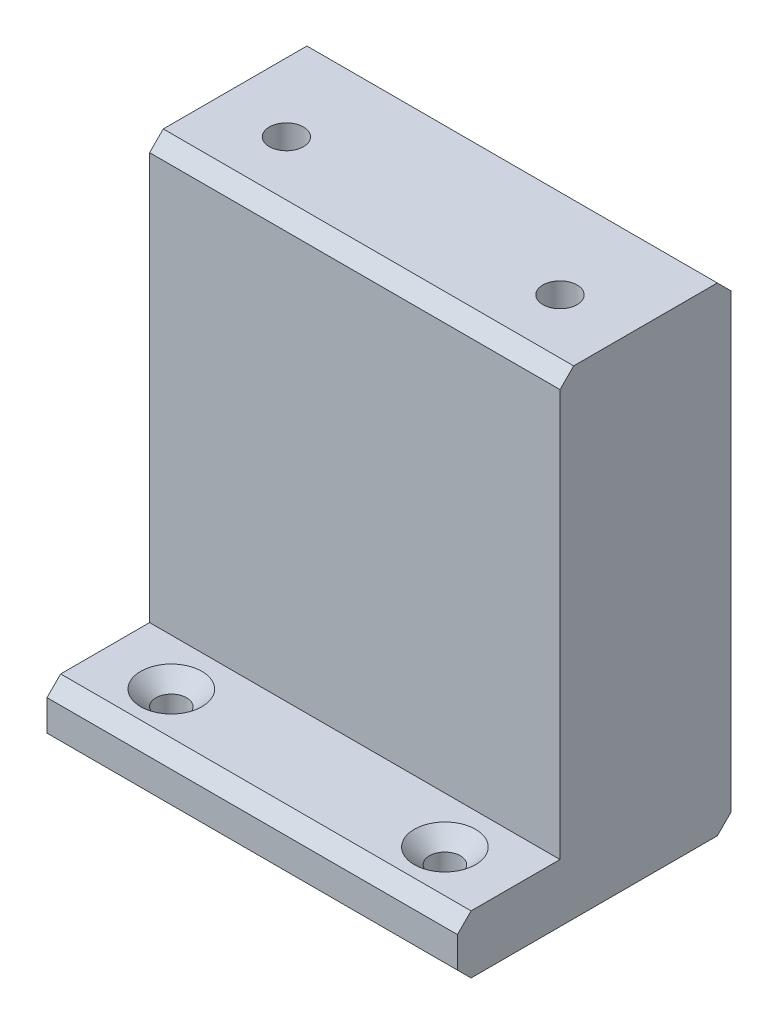
ISO-10303-21;
HEADER;
FILE_DESCRIPTION(('STEP AP214'),'2;1');
FILE_NAME('part.step','',(''),(''),'','','');
FILE_SCHEMA(('AUTOMOTIVE_DESIGN { 1 0 10303 214 1 1 1 1 }'));
ENDSEC;
DATA;
#1=APPLICATION_CONTEXT('core data for automotive mechanical design processes');
#2=APPLICATION_PROTOCOL_DEFINITION('international standard','automotive_design',2000,#1);
#3=PRODUCT_CONTEXT('',#1,'mechanical');
#4=PRODUCT('Part','Part','',(#3));
#5=PRODUCT_RELATED_PRODUCT_CATEGORY('part','',(#4));
#6=PRODUCT_DEFINITION_FORMATION('','',#4);
#7=PRODUCT_DEFINITION_CONTEXT('part definition',#1,'design');
#8=PRODUCT_DEFINITION('design','',#6,#7);
#9=PRODUCT_DEFINITION_SHAPE('','',#8);
#10=(LENGTH_UNIT() NAMED_UNIT(*) SI_UNIT(.MILLI.,.METRE.));
#11=(NAMED_UNIT(*) PLANE_ANGLE_UNIT() SI_UNIT($,.RADIAN.));
#12=(NAMED_UNIT(*) SI_UNIT($,.STERADIAN.) SOLID_ANGLE_UNIT());
#13=UNCERTAINTY_MEASURE_WITH_UNIT(LENGTH_MEASURE(1.E-05),#10,'distance_accuracy_value','');
#14=(GEOMETRIC_REPRESENTATION_CONTEXT(3) GLOBAL_UNCERTAINTY_ASSIGNED_CONTEXT((#13)) GLOBAL_UNIT_ASSIGNED_CONTEXT((#10,
#11,#12)) REPRESENTATION_CONTEXT('',''));
#15=CARTESIAN_POINT('',(0.,0.,0.));
#16=DIRECTION('',(0.,0.,1.));
#17=DIRECTION('',(1.,0.,0.));
#18=AXIS2_PLACEMENT_3D('',#15,#16,#17);
#19=CARTESIAN_POINT('',(0.,0.,0.));
#20=DIRECTION('',(0.,-1.,0.));
#21=DIRECTION('',(0.,0.,-1.));
#22=AXIS2_PLACEMENT_3D('',#19,#20,#21);
#23=PLANE('',#22);
#24=DIRECTION('',(0.,0.,1.));
#25=VECTOR('',#24,1.);
#26=CARTESIAN_POINT('',(-30.,0.,20.));
#27=LINE('',#26,#25);
#28=CARTESIAN_POINT('',(-30.,0.,-18.));
#29=VERTEX_POINT('',#28);
#30=CARTESIAN_POINT('',(-30.,0.,18.));
#31=VERTEX_POINT('',#30);
#32=EDGE_CURVE('E292',#29,#31,#27,.T.);
#33=ORIENTED_EDGE('',*,*,#32,.F.);
#34=DIRECTION('',(1.,0.,0.));
#35=VECTOR('',#34,1.);
#36=CARTESIAN_POINT('',(30.,0.,-18.));
#37=LINE('',#36,#35);
#38=CARTESIAN_POINT('',(30.,0.,-18.));
#39=VERTEX_POINT('',#38);
#40=EDGE_CURVE('E342',#29,#39,#37,.T.);
#41=ORIENTED_EDGE('',*,*,#40,.T.);
#42=DIRECTION('',(0.,0.,-1.));
#43=VECTOR('',#42,1.);
#44=CARTESIAN_POINT('',(30.,0.,20.));
#45=LINE('',#44,#43);
#46=CARTESIAN_POINT('',(30.,0.,18.));
#47=VERTEX_POINT('',#46);
#48=EDGE_CURVE('E286',#47,#39,#45,.T.);
#49=ORIENTED_EDGE('',*,*,#48,.F.);
#50=DIRECTION('',(-1.,0.,0.));
#51=VECTOR('',#50,1.);
#52=CARTESIAN_POINT('',(-30.,0.,18.));
#53=LINE('',#52,#51);
#54=EDGE_CURVE('E339',#47,#31,#53,.T.);
#55=ORIENTED_EDGE('',*,*,#54,.T.);
#56=EDGE_LOOP('',(#33,#41,#49,#55));
#57=FACE_BOUND('',#56,.T.);
#58=CARTESIAN_POINT('',(20.,0.,11.825));
#59=DIRECTION('',(0.,1.,0.));
#60=DIRECTION('',(0.,0.,1.));
#61=AXIS2_PLACEMENT_3D('',#58,#59,#60);
#62=CIRCLE('',#61,2.25);
#63=CARTESIAN_POINT('',(20.,0.,14.075));
#64=VERTEX_POINT('',#63);
#65=EDGE_CURVE('E264',#64,#64,#62,.T.);
#66=ORIENTED_EDGE('',*,*,#65,.T.);
#67=EDGE_LOOP('',(#66));
#68=FACE_BOUND('',#67,.T.);
#69=CARTESIAN_POINT('',(-20.,0.,11.825));
#70=DIRECTION('',(0.,1.,0.));
#71=DIRECTION('',(0.,0.,1.));
#72=AXIS2_PLACEMENT_3D('',#69,#70,#71);
#73=CIRCLE('',#72,2.25);
#74=CARTESIAN_POINT('',(-20.,0.,14.075));
#75=VERTEX_POINT('',#74);
#76=EDGE_CURVE('E252',#75,#75,#73,.T.);
#77=ORIENTED_EDGE('',*,*,#76,.T.);
#78=EDGE_LOOP('',(#77));
#79=FACE_BOUND('',#78,.T.);
#80=ADVANCED_FACE('F43',(#57,#68,#79),#23,.T.);
#81=CARTESIAN_POINT('',(30.,70.,20.));
#82=DIRECTION('',(-1.,0.,0.));
#83=DIRECTION('',(0.,0.,1.));
#84=AXIS2_PLACEMENT_3D('',#81,#82,#83);
#85=PLANE('',#84);
#86=ORIENTED_EDGE('',*,*,#48,.T.);
#87=DIRECTION('',(0.,0.707106781186545,-0.70710678118655));
#88=VECTOR('',#87,1.);
#89=CARTESIAN_POINT('',(30.,2.00000000000002,-20.));
#90=LINE('',#89,#88);
#91=CARTESIAN_POINT('',(30.,2.00000000000002,-20.));
#92=VERTEX_POINT('',#91);
#93=EDGE_CURVE('E355',#39,#92,#90,.T.);
#94=ORIENTED_EDGE('',*,*,#93,.T.);
#95=DIRECTION('',(0.,-1.,0.));
#96=VECTOR('',#95,1.);
#97=CARTESIAN_POINT('',(30.,70.,-20.));
#98=LINE('',#97,#96);
#99=CARTESIAN_POINT('',(30.,68.,-20.));
#100=VERTEX_POINT('',#99);
#101=EDGE_CURVE('E313',#100,#92,#98,.T.);
#102=ORIENTED_EDGE('',*,*,#101,.F.);
#103=DIRECTION('',(0.,-0.70710678118655,-0.707106781186545));
#104=VECTOR('',#103,1.);
#105=CARTESIAN_POINT('',(30.,70.,-18.));
#106=LINE('',#105,#104);
#107=CARTESIAN_POINT('',(30.,70.,-18.));
#108=VERTEX_POINT('',#107);
#109=EDGE_CURVE('E348',#100,#108,#106,.F.);
#110=ORIENTED_EDGE('',*,*,#109,.T.);
#111=DIRECTION('',(0.,0.,-1.));
#112=VECTOR('',#111,1.);
#113=CARTESIAN_POINT('',(30.,70.,20.));
#114=LINE('',#113,#112);
#115=CARTESIAN_POINT('',(30.,70.,2.99999999999999));
#116=VERTEX_POINT('',#115);
#117=EDGE_CURVE('E287',#116,#108,#114,.T.);
#118=ORIENTED_EDGE('',*,*,#117,.F.);
#119=DIRECTION('',(0.,0.70710678118655,-0.707106781186545));
#120=VECTOR('',#119,1.);
#121=CARTESIAN_POINT('',(30.,70.,2.99999999999999));
#122=LINE('',#121,#120);
#123=CARTESIAN_POINT('',(30.,68.,5.));
#124=VERTEX_POINT('',#123);
#125=EDGE_CURVE('E345',#116,#124,#122,.F.);
#126=ORIENTED_EDGE('',*,*,#125,.T.);
#127=DIRECTION('',(0.,1.,0.));
#128=VECTOR('',#127,1.);
#129=CARTESIAN_POINT('',(30.,8.5,5.));
#130=LINE('',#129,#128);
#131=CARTESIAN_POINT('',(30.,8.5,5.));
#132=VERTEX_POINT('',#131);
#133=EDGE_CURVE('E268',#132,#124,#130,.T.);
#134=ORIENTED_EDGE('',*,*,#133,.F.);
#135=DIRECTION('',(0.,0.,-1.));
#136=VECTOR('',#135,1.);
#137=CARTESIAN_POINT('',(30.,8.5,20.));
#138=LINE('',#137,#136);
#139=CARTESIAN_POINT('',(30.,8.5,18.));
#140=VERTEX_POINT('',#139);
#141=EDGE_CURVE('E272',#140,#132,#138,.T.);
#142=ORIENTED_EDGE('',*,*,#141,.F.);
#143=DIRECTION('',(0.,0.707106781186546,-0.707106781186549));
#144=VECTOR('',#143,1.);
#145=CARTESIAN_POINT('',(30.,8.5,18.));
#146=LINE('',#145,#144);
#147=CARTESIAN_POINT('',(30.,6.50000000000002,20.));
#148=VERTEX_POINT('',#147);
#149=EDGE_CURVE('E68',#140,#148,#146,.F.);
#150=ORIENTED_EDGE('',*,*,#149,.T.);
#151=DIRECTION('',(0.,-1.,0.));
#152=VECTOR('',#151,1.);
#153=CARTESIAN_POINT('',(30.,70.,20.));
#154=LINE('',#153,#152);
#155=CARTESIAN_POINT('',(30.,2.00000000000002,20.));
#156=VERTEX_POINT('',#155);
#157=EDGE_CURVE('E296',#148,#156,#154,.T.);
#158=ORIENTED_EDGE('',*,*,#157,.T.);
#159=DIRECTION('',(0.,-0.707106781186545,-0.70710678118655));
#160=VECTOR('',#159,1.);
#161=CARTESIAN_POINT('',(30.,2.00000000000002,20.));
#162=LINE('',#161,#160);
#163=EDGE_CURVE('E60',#156,#47,#162,.T.);
#164=ORIENTED_EDGE('',*,*,#163,.T.);
#165=EDGE_LOOP('',(#86,#94,#102,#110,#118,#126,#134,#142,#150,#158,#164));
#166=FACE_BOUND('',#165,.T.);
#167=ADVANCED_FACE('F388',(#166),#85,.F.);
#168=CARTESIAN_POINT('',(-30.,70.,-20.));
#169=DIRECTION('',(0.,0.,1.));
#170=DIRECTION('',(1.,0.,0.));
#171=AXIS2_PLACEMENT_3D('',#168,#169,#170);
#172=PLANE('',#171);
#173=CARTESIAN_POINT('',(-20.,55.,-20.));
#174=DIRECTION('',(0.,0.,-1.));
#175=DIRECTION('',(-1.,0.,0.));
#176=AXIS2_PLACEMENT_3D('',#173,#174,#175);
#177=CIRCLE('',#176,2.5);
#178=CARTESIAN_POINT('',(-22.5,55.,-20.));
#179=VERTEX_POINT('',#178);
#180=EDGE_CURVE('E180',#179,#179,#177,.T.);
#181=ORIENTED_EDGE('',*,*,#180,.F.);
#182=EDGE_LOOP('',(#181));
#183=FACE_BOUND('',#182,.T.);
#184=CARTESIAN_POINT('',(20.,15.,-20.));
#185=DIRECTION('',(0.,0.,-1.));
#186=DIRECTION('',(-1.,0.,0.));
#187=AXIS2_PLACEMENT_3D('',#184,#185,#186);
#188=CIRCLE('',#187,2.5);
#189=CARTESIAN_POINT('',(17.5,15.,-20.));
#190=VERTEX_POINT('',#189);
#191=EDGE_CURVE('E196',#190,#190,#188,.T.);
#192=ORIENTED_EDGE('',*,*,#191,.F.);
#193=EDGE_LOOP('',(#192));
#194=FACE_BOUND('',#193,.T.);
#195=CARTESIAN_POINT('',(20.,55.,-20.));
#196=DIRECTION('',(0.,0.,-1.));
#197=DIRECTION('',(-1.,0.,0.));
#198=AXIS2_PLACEMENT_3D('',#195,#196,#197);
#199=CIRCLE('',#198,2.5);
#200=CARTESIAN_POINT('',(17.5,55.,-20.));
#201=VERTEX_POINT('',#200);
#202=EDGE_CURVE('E212',#201,#201,#199,.T.);
#203=ORIENTED_EDGE('',*,*,#202,.F.);
#204=EDGE_LOOP('',(#203));
#205=FACE_BOUND('',#204,.T.);
#206=CARTESIAN_POINT('',(-20.,15.,-20.));
#207=DIRECTION('',(0.,0.,-1.));
#208=DIRECTION('',(-1.,0.,0.));
#209=AXIS2_PLACEMENT_3D('',#206,#207,#208);
#210=CIRCLE('',#209,2.5);
#211=CARTESIAN_POINT('',(-22.5,15.,-20.));
#212=VERTEX_POINT('',#211);
#213=EDGE_CURVE('E228',#212,#212,#210,.T.);
#214=ORIENTED_EDGE('',*,*,#213,.F.);
#215=EDGE_LOOP('',(#214));
#216=FACE_BOUND('',#215,.T.);
#217=ORIENTED_EDGE('',*,*,#101,.T.);
#218=DIRECTION('',(-1.,0.,0.));
#219=VECTOR('',#218,1.);
#220=CARTESIAN_POINT('',(-30.,2.00000000000002,-20.));
#221=LINE('',#220,#219);
#222=CARTESIAN_POINT('',(-30.,2.00000000000002,-20.));
#223=VERTEX_POINT('',#222);
#224=EDGE_CURVE('E320',#92,#223,#221,.T.);
#225=ORIENTED_EDGE('',*,*,#224,.T.);
#226=DIRECTION('',(0.,-1.,0.));
#227=VECTOR('',#226,1.);
#228=CARTESIAN_POINT('',(-30.,70.,-20.));
#229=LINE('',#228,#227);
#230=CARTESIAN_POINT('',(-30.,68.,-20.));
#231=VERTEX_POINT('',#230);
#232=EDGE_CURVE('E309',#231,#223,#229,.T.);
#233=ORIENTED_EDGE('',*,*,#232,.F.);
#234=DIRECTION('',(1.,0.,0.));
#235=VECTOR('',#234,1.);
#236=CARTESIAN_POINT('',(-30.,68.,-20.));
#237=LINE('',#236,#235);
#238=EDGE_CURVE('E317',#231,#100,#237,.T.);
#239=ORIENTED_EDGE('',*,*,#238,.T.);
#240=EDGE_LOOP('',(#217,#225,#233,#239));
#241=FACE_BOUND('',#240,.T.);
#242=ADVANCED_FACE('F394',(#183,#194,#205,#216,#241),#172,.F.);
#243=CARTESIAN_POINT('',(-30.,70.,20.));
#244=DIRECTION('',(1.,0.,0.));
#245=DIRECTION('',(0.,0.,-1.));
#246=AXIS2_PLACEMENT_3D('',#243,#244,#245);
#247=PLANE('',#246);
#248=ORIENTED_EDGE('',*,*,#232,.T.);
#249=DIRECTION('',(0.,-0.707106781186545,0.70710678118655));
#250=VECTOR('',#249,1.);
#251=CARTESIAN_POINT('',(-30.,2.00000000000002,-20.));
#252=LINE('',#251,#250);
#253=EDGE_CURVE('E336',#223,#29,#252,.T.);
#254=ORIENTED_EDGE('',*,*,#253,.T.);
#255=ORIENTED_EDGE('',*,*,#32,.T.);
#256=DIRECTION('',(0.,0.707106781186545,0.70710678118655));
#257=VECTOR('',#256,1.);
#258=CARTESIAN_POINT('',(-30.,2.00000000000002,20.));
#259=LINE('',#258,#257);
#260=CARTESIAN_POINT('',(-30.,2.00000000000002,20.));
#261=VERTEX_POINT('',#260);
#262=EDGE_CURVE('E333',#31,#261,#259,.T.);
#263=ORIENTED_EDGE('',*,*,#262,.T.);
#264=DIRECTION('',(0.,-1.,0.));
#265=VECTOR('',#264,1.);
#266=CARTESIAN_POINT('',(-30.,70.,20.));
#267=LINE('',#266,#265);
#268=CARTESIAN_POINT('',(-30.,6.50000000000002,20.));
#269=VERTEX_POINT('',#268);
#270=EDGE_CURVE('E305',#269,#261,#267,.T.);
#271=ORIENTED_EDGE('',*,*,#270,.F.);
#272=DIRECTION('',(0.,-0.707106781186546,0.707106781186549));
#273=VECTOR('',#272,1.);
#274=CARTESIAN_POINT('',(-30.,8.5,18.));
#275=LINE('',#274,#273);
#276=CARTESIAN_POINT('',(-30.,8.5,18.));
#277=VERTEX_POINT('',#276);
#278=EDGE_CURVE('E330',#269,#277,#275,.F.);
#279=ORIENTED_EDGE('',*,*,#278,.T.);
#280=DIRECTION('',(0.,0.,-1.));
#281=VECTOR('',#280,1.);
#282=CARTESIAN_POINT('',(-30.,8.5,20.));
#283=LINE('',#282,#281);
#284=CARTESIAN_POINT('',(-30.,8.5,5.));
#285=VERTEX_POINT('',#284);
#286=EDGE_CURVE('E283',#277,#285,#283,.T.);
#287=ORIENTED_EDGE('',*,*,#286,.T.);
#288=DIRECTION('',(0.,1.,0.));
#289=VECTOR('',#288,1.);
#290=CARTESIAN_POINT('',(-30.,70.,5.));
#291=LINE('',#290,#289);
#292=CARTESIAN_POINT('',(-30.,68.,5.));
#293=VERTEX_POINT('',#292);
#294=EDGE_CURVE('E279',#285,#293,#291,.T.);
#295=ORIENTED_EDGE('',*,*,#294,.T.);
#296=DIRECTION('',(0.,-0.70710678118655,0.707106781186545));
#297=VECTOR('',#296,1.);
#298=CARTESIAN_POINT('',(-30.,70.,2.99999999999999));
#299=LINE('',#298,#297);
#300=CARTESIAN_POINT('',(-30.,70.,2.99999999999999));
#301=VERTEX_POINT('',#300);
#302=EDGE_CURVE('E324',#293,#301,#299,.F.);
#303=ORIENTED_EDGE('',*,*,#302,.T.);
#304=DIRECTION('',(0.,0.,1.));
#305=VECTOR('',#304,1.);
#306=CARTESIAN_POINT('',(-30.,70.,20.));
#307=LINE('',#306,#305);
#308=CARTESIAN_POINT('',(-30.,70.,-18.));
#309=VERTEX_POINT('',#308);
#310=EDGE_CURVE('E291',#309,#301,#307,.T.);
#311=ORIENTED_EDGE('',*,*,#310,.F.);
#312=DIRECTION('',(0.,0.70710678118655,0.707106781186545));
#313=VECTOR('',#312,1.);
#314=CARTESIAN_POINT('',(-30.,70.,-18.));
#315=LINE('',#314,#313);
#316=EDGE_CURVE('E327',#309,#231,#315,.F.);
#317=ORIENTED_EDGE('',*,*,#316,.T.);
#318=EDGE_LOOP('',(#248,#254,#255,#263,#271,#279,#287,#295,#303,#311,#317));
#319=FACE_BOUND('',#318,.T.);
#320=ADVANCED_FACE('F382',(#319),#247,.F.);
#321=CARTESIAN_POINT('',(-30.,70.,20.));
#322=DIRECTION('',(0.,0.,-1.));
#323=DIRECTION('',(-1.,0.,0.));
#324=AXIS2_PLACEMENT_3D('',#321,#322,#323);
#325=PLANE('',#324);
#326=ORIENTED_EDGE('',*,*,#270,.T.);
#327=DIRECTION('',(1.,0.,0.));
#328=VECTOR('',#327,1.);
#329=CARTESIAN_POINT('',(30.,2.00000000000002,20.));
#330=LINE('',#329,#328);
#331=EDGE_CURVE('E361',#261,#156,#330,.T.);
#332=ORIENTED_EDGE('',*,*,#331,.T.);
#333=ORIENTED_EDGE('',*,*,#157,.F.);
#334=DIRECTION('',(-1.,0.,0.));
#335=VECTOR('',#334,1.);
#336=CARTESIAN_POINT('',(-30.,6.50000000000002,20.));
#337=LINE('',#336,#335);
#338=EDGE_CURVE('E358',#148,#269,#337,.T.);
#339=ORIENTED_EDGE('',*,*,#338,.T.);
#340=EDGE_LOOP('',(#326,#332,#333,#339));
#341=FACE_BOUND('',#340,.T.);
#342=ADVANCED_FACE('F409',(#341),#325,.F.);
#343=CARTESIAN_POINT('',(0.,70.,0.));
#344=DIRECTION('',(0.,-1.,0.));
#345=DIRECTION('',(0.,0.,-1.));
#346=AXIS2_PLACEMENT_3D('',#343,#344,#345);
#347=PLANE('',#346);
#348=CARTESIAN_POINT('',(-20.,70.,-5.));
#349=DIRECTION('',(0.,1.,0.));
#350=DIRECTION('',(0.,0.,1.));
#351=AXIS2_PLACEMENT_3D('',#348,#349,#350);
#352=CIRCLE('',#351,2.5);
#353=CARTESIAN_POINT('',(-20.,70.,-2.5));
#354=VERTEX_POINT('',#353);
#355=EDGE_CURVE('E895',#354,#354,#352,.T.);
#356=ORIENTED_EDGE('',*,*,#355,.F.);
#357=EDGE_LOOP('',(#356));
#358=FACE_BOUND('',#357,.T.);
#359=CARTESIAN_POINT('',(20.,70.,-5.));
#360=DIRECTION('',(0.,1.,0.));
#361=DIRECTION('',(0.,0.,1.));
#362=AXIS2_PLACEMENT_3D('',#359,#360,#361);
#363=CIRCLE('',#362,2.5);
#364=CARTESIAN_POINT('',(20.,70.,-2.5));
#365=VERTEX_POINT('',#364);
#366=EDGE_CURVE('E156',#365,#365,#363,.T.);
#367=ORIENTED_EDGE('',*,*,#366,.F.);
#368=EDGE_LOOP('',(#367));
#369=FACE_BOUND('',#368,.T.);
#370=ORIENTED_EDGE('',*,*,#117,.T.);
#371=DIRECTION('',(-1.,0.,0.));
#372=VECTOR('',#371,1.);
#373=CARTESIAN_POINT('',(0.,70.,-18.));
#374=LINE('',#373,#372);
#375=EDGE_CURVE('E53',#108,#309,#374,.T.);
#376=ORIENTED_EDGE('',*,*,#375,.T.);
#377=ORIENTED_EDGE('',*,*,#310,.T.);
#378=DIRECTION('',(1.,0.,0.));
#379=VECTOR('',#378,1.);
#380=CARTESIAN_POINT('',(0.,70.,2.99999999999999));
#381=LINE('',#380,#379);
#382=EDGE_CURVE('E368',#301,#116,#381,.T.);
#383=ORIENTED_EDGE('',*,*,#382,.T.);
#384=EDGE_LOOP('',(#370,#376,#377,#383));
#385=FACE_BOUND('',#384,.T.);
#386=ADVANCED_FACE('F376',(#358,#369,#385),#347,.F.);
#387=CARTESIAN_POINT('',(-60.,8.5,20.));
#388=DIRECTION('',(0.,-1.,0.));
#389=DIRECTION('',(0.,0.,-1.));
#390=AXIS2_PLACEMENT_3D('',#387,#388,#389);
#391=PLANE('',#390);
#392=CARTESIAN_POINT('',(-20.,8.5,11.825));
#393=DIRECTION('',(0.,1.,0.));
#394=DIRECTION('',(0.,0.,1.));
#395=AXIS2_PLACEMENT_3D('',#392,#393,#394);
#396=CIRCLE('',#395,4.48);
#397=CARTESIAN_POINT('',(-20.,8.5,16.305));
#398=VERTEX_POINT('',#397);
#399=EDGE_CURVE('E244',#398,#398,#396,.T.);
#400=ORIENTED_EDGE('',*,*,#399,.F.);
#401=EDGE_LOOP('',(#400));
#402=FACE_BOUND('',#401,.T.);
#403=CARTESIAN_POINT('',(20.,8.5,11.825));
#404=DIRECTION('',(0.,1.,0.));
#405=DIRECTION('',(0.,0.,1.));
#406=AXIS2_PLACEMENT_3D('',#403,#404,#405);
#407=CIRCLE('',#406,4.48);
#408=CARTESIAN_POINT('',(20.,8.5,16.305));
#409=VERTEX_POINT('',#408);
#410=EDGE_CURVE('E256',#409,#409,#407,.T.);
#411=ORIENTED_EDGE('',*,*,#410,.F.);
#412=EDGE_LOOP('',(#411));
#413=FACE_BOUND('',#412,.T.);
#414=ORIENTED_EDGE('',*,*,#286,.F.);
#415=DIRECTION('',(1.,0.,0.));
#416=VECTOR('',#415,1.);
#417=CARTESIAN_POINT('',(-60.,8.5,18.));
#418=LINE('',#417,#416);
#419=EDGE_CURVE('E364',#277,#140,#418,.T.);
#420=ORIENTED_EDGE('',*,*,#419,.T.);
#421=ORIENTED_EDGE('',*,*,#141,.T.);
#422=DIRECTION('',(1.,0.,0.));
#423=VECTOR('',#422,1.);
#424=CARTESIAN_POINT('',(-60.,8.5,5.));
#425=LINE('',#424,#423);
#426=EDGE_CURVE('E275',#285,#132,#425,.T.);
#427=ORIENTED_EDGE('',*,*,#426,.F.);
#428=EDGE_LOOP('',(#414,#420,#421,#427));
#429=FACE_BOUND('',#428,.T.);
#430=ADVANCED_FACE('F417',(#402,#413,#429),#391,.F.);
#431=CARTESIAN_POINT('',(-60.,8.5,5.));
#432=DIRECTION('',(0.,0.,-1.));
#433=DIRECTION('',(-1.,0.,0.));
#434=AXIS2_PLACEMENT_3D('',#431,#432,#433);
#435=PLANE('',#434);
#436=ORIENTED_EDGE('',*,*,#133,.T.);
#437=DIRECTION('',(-1.,0.,0.));
#438=VECTOR('',#437,1.);
#439=CARTESIAN_POINT('',(-60.,68.,5.));
#440=LINE('',#439,#438);
#441=EDGE_CURVE('E11',#124,#293,#440,.T.);
#442=ORIENTED_EDGE('',*,*,#441,.T.);
#443=ORIENTED_EDGE('',*,*,#294,.F.);
#444=ORIENTED_EDGE('',*,*,#426,.T.);
#445=EDGE_LOOP('',(#436,#442,#443,#444));
#446=FACE_BOUND('',#445,.T.);
#447=ADVANCED_FACE('F419',(#446),#435,.F.);
#448=CARTESIAN_POINT('',(20.,8.5,11.825));
#449=DIRECTION('',(0.,1.,0.));
#450=DIRECTION('',(0.,0.,1.));
#451=AXIS2_PLACEMENT_3D('',#448,#449,#450);
#452=CYLINDRICAL_SURFACE('',#451,2.25);
#453=ORIENTED_EDGE('',*,*,#65,.F.);
#454=EDGE_LOOP('',(#453));
#455=FACE_BOUND('',#454,.T.);
#456=CARTESIAN_POINT('',(20.,6.27,11.825));
#457=DIRECTION('',(0.,1.,0.));
#458=DIRECTION('',(0.,0.,1.));
#459=AXIS2_PLACEMENT_3D('',#456,#457,#458);
#460=CIRCLE('',#459,2.25);
#461=CARTESIAN_POINT('',(20.,6.27,14.075));
#462=VERTEX_POINT('',#461);
#463=EDGE_CURVE('E260',#462,#462,#460,.T.);
#464=ORIENTED_EDGE('',*,*,#463,.T.);
#465=EDGE_LOOP('',(#464));
#466=FACE_BOUND('',#465,.T.);
#467=ADVANCED_FACE('F421',(#455,#466),#452,.F.);
#468=CARTESIAN_POINT('',(20.,8.5,11.825));
#469=DIRECTION('',(0.,1.,0.));
#470=DIRECTION('',(0.,0.,1.));
#471=AXIS2_PLACEMENT_3D('',#468,#469,#470);
#472=CONICAL_SURFACE('',#471,4.48,0.785398163397449);
#473=ORIENTED_EDGE('',*,*,#463,.F.);
#474=EDGE_LOOP('',(#473));
#475=FACE_BOUND('',#474,.T.);
#476=ORIENTED_EDGE('',*,*,#410,.T.);
#477=EDGE_LOOP('',(#476));
#478=FACE_BOUND('',#477,.T.);
#479=ADVANCED_FACE('F427',(#475,#478),#472,.F.);
#480=CARTESIAN_POINT('',(-20.,8.5,11.825));
#481=DIRECTION('',(0.,1.,0.));
#482=DIRECTION('',(0.,0.,1.));
#483=AXIS2_PLACEMENT_3D('',#480,#481,#482);
#484=CYLINDRICAL_SURFACE('',#483,2.25);
#485=ORIENTED_EDGE('',*,*,#76,.F.);
#486=EDGE_LOOP('',(#485));
#487=FACE_BOUND('',#486,.T.);
#488=CARTESIAN_POINT('',(-20.,6.27,11.825));
#489=DIRECTION('',(0.,1.,0.));
#490=DIRECTION('',(0.,0.,1.));
#491=AXIS2_PLACEMENT_3D('',#488,#489,#490);
#492=CIRCLE('',#491,2.25);
#493=CARTESIAN_POINT('',(-20.,6.27,14.075));
#494=VERTEX_POINT('',#493);
#495=EDGE_CURVE('E248',#494,#494,#492,.T.);
#496=ORIENTED_EDGE('',*,*,#495,.T.);
#497=EDGE_LOOP('',(#496));
#498=FACE_BOUND('',#497,.T.);
#499=ADVANCED_FACE('F789',(#487,#498),#484,.F.);
#500=CARTESIAN_POINT('',(-20.,8.5,11.825));
#501=DIRECTION('',(0.,1.,0.));
#502=DIRECTION('',(0.,0.,1.));
#503=AXIS2_PLACEMENT_3D('',#500,#501,#502);
#504=CONICAL_SURFACE('',#503,4.48,0.785398163397449);
#505=ORIENTED_EDGE('',*,*,#495,.F.);
#506=EDGE_LOOP('',(#505));
#507=FACE_BOUND('',#506,.T.);
#508=ORIENTED_EDGE('',*,*,#399,.T.);
#509=EDGE_LOOP('',(#508));
#510=FACE_BOUND('',#509,.T.);
#511=ADVANCED_FACE('F779',(#507,#510),#504,.F.);
#512=CARTESIAN_POINT('',(-20.,15.,-10.));
#513=DIRECTION('',(0.,0.,-1.));
#514=DIRECTION('',(-1.,0.,0.));
#515=AXIS2_PLACEMENT_3D('',#512,#513,#514);
#516=CONICAL_SURFACE('',#515,2.25,1.02974425867665);
#517=CARTESIAN_POINT('',(-20.,15.,-8.64806360718799));
#518=VERTEX_POINT('',#517);
#519=VERTEX_LOOP('',#518);
#520=FACE_BOUND('',#519,.T.);
#521=CARTESIAN_POINT('',(-20.,15.,-10.));
#522=DIRECTION('',(0.,0.,-1.));
#523=DIRECTION('',(-1.,0.,0.));
#524=AXIS2_PLACEMENT_3D('',#521,#522,#523);
#525=CIRCLE('',#524,2.25);
#526=CARTESIAN_POINT('',(-22.25,15.,-10.));
#527=VERTEX_POINT('',#526);
#528=EDGE_CURVE('E240',#527,#527,#525,.T.);
#529=ORIENTED_EDGE('',*,*,#528,.T.);
#530=EDGE_LOOP('',(#529));
#531=FACE_BOUND('',#530,.T.);
#532=ADVANCED_FACE('F769',(#520,#531),#516,.F.);
#533=CARTESIAN_POINT('',(-20.,15.,-20.));
#534=DIRECTION('',(0.,0.,-1.));
#535=DIRECTION('',(-1.,0.,0.));
#536=AXIS2_PLACEMENT_3D('',#533,#534,#535);
#537=CYLINDRICAL_SURFACE('',#536,2.25);
#538=ORIENTED_EDGE('',*,*,#528,.F.);
#539=EDGE_LOOP('',(#538));
#540=FACE_BOUND('',#539,.T.);
#541=CARTESIAN_POINT('',(-20.,15.,-15.8));
#542=DIRECTION('',(0.,0.,-1.));
#543=DIRECTION('',(-1.,0.,0.));
#544=AXIS2_PLACEMENT_3D('',#541,#542,#543);
#545=CIRCLE('',#544,2.25);
#546=CARTESIAN_POINT('',(-22.25,15.,-15.8));
#547=VERTEX_POINT('',#546);
#548=EDGE_CURVE('E236',#547,#547,#545,.T.);
#549=ORIENTED_EDGE('',*,*,#548,.T.);
#550=EDGE_LOOP('',(#549));
#551=FACE_BOUND('',#550,.T.);
#552=ADVANCED_FACE('F759',(#540,#551),#537,.F.);
#553=CARTESIAN_POINT('',(-17.75,15.,-15.8));
#554=DIRECTION('',(0.,0.,1.));
#555=DIRECTION('',(1.,0.,0.));
#556=AXIS2_PLACEMENT_3D('',#553,#554,#555);
#557=PLANE('',#556);
#558=ORIENTED_EDGE('',*,*,#548,.F.);
#559=EDGE_LOOP('',(#558));
#560=FACE_BOUND('',#559,.T.);
#561=CARTESIAN_POINT('',(-20.,15.,-15.8));
#562=DIRECTION('',(0.,0.,-1.));
#563=DIRECTION('',(-1.,0.,0.));
#564=AXIS2_PLACEMENT_3D('',#561,#562,#563);
#565=CIRCLE('',#564,2.5);
#566=CARTESIAN_POINT('',(-22.5,15.,-15.8));
#567=VERTEX_POINT('',#566);
#568=EDGE_CURVE('E232',#567,#567,#565,.T.);
#569=ORIENTED_EDGE('',*,*,#568,.T.);
#570=EDGE_LOOP('',(#569));
#571=FACE_BOUND('',#570,.T.);
#572=ADVANCED_FACE('F749',(#560,#571),#557,.F.);
#573=CARTESIAN_POINT('',(-20.,15.,-20.));
#574=DIRECTION('',(0.,0.,-1.));
#575=DIRECTION('',(-1.,0.,0.));
#576=AXIS2_PLACEMENT_3D('',#573,#574,#575);
#577=CYLINDRICAL_SURFACE('',#576,2.5);
#578=ORIENTED_EDGE('',*,*,#568,.F.);
#579=EDGE_LOOP('',(#578));
#580=FACE_BOUND('',#579,.T.);
#581=ORIENTED_EDGE('',*,*,#213,.T.);
#582=EDGE_LOOP('',(#581));
#583=FACE_BOUND('',#582,.T.);
#584=ADVANCED_FACE('F739',(#580,#583),#577,.F.);
#585=CARTESIAN_POINT('',(20.,55.,-10.));
#586=DIRECTION('',(0.,0.,-1.));
#587=DIRECTION('',(-1.,0.,0.));
#588=AXIS2_PLACEMENT_3D('',#585,#586,#587);
#589=CONICAL_SURFACE('',#588,2.25,1.02974425867665);
#590=CARTESIAN_POINT('',(20.,55.,-8.64806360718799));
#591=VERTEX_POINT('',#590);
#592=VERTEX_LOOP('',#591);
#593=FACE_BOUND('',#592,.T.);
#594=CARTESIAN_POINT('',(20.,55.,-10.));
#595=DIRECTION('',(0.,0.,-1.));
#596=DIRECTION('',(-1.,0.,0.));
#597=AXIS2_PLACEMENT_3D('',#594,#595,#596);
#598=CIRCLE('',#597,2.25);
#599=CARTESIAN_POINT('',(17.75,55.,-10.));
#600=VERTEX_POINT('',#599);
#601=EDGE_CURVE('E224',#600,#600,#598,.T.);
#602=ORIENTED_EDGE('',*,*,#601,.T.);
#603=EDGE_LOOP('',(#602));
#604=FACE_BOUND('',#603,.T.);
#605=ADVANCED_FACE('F729',(#593,#604),#589,.F.);
#606=CARTESIAN_POINT('',(20.,55.,-20.));
#607=DIRECTION('',(0.,0.,-1.));
#608=DIRECTION('',(-1.,0.,0.));
#609=AXIS2_PLACEMENT_3D('',#606,#607,#608);
#610=CYLINDRICAL_SURFACE('',#609,2.25);
#611=ORIENTED_EDGE('',*,*,#601,.F.);
#612=EDGE_LOOP('',(#611));
#613=FACE_BOUND('',#612,.T.);
#614=CARTESIAN_POINT('',(20.,55.,-15.8));
#615=DIRECTION('',(0.,0.,-1.));
#616=DIRECTION('',(-1.,0.,0.));
#617=AXIS2_PLACEMENT_3D('',#614,#615,#616);
#618=CIRCLE('',#617,2.25);
#619=CARTESIAN_POINT('',(17.75,55.,-15.8));
#620=VERTEX_POINT('',#619);
#621=EDGE_CURVE('E220',#620,#620,#618,.T.);
#622=ORIENTED_EDGE('',*,*,#621,.T.);
#623=EDGE_LOOP('',(#622));
#624=FACE_BOUND('',#623,.T.);
#625=ADVANCED_FACE('F719',(#613,#624),#610,.F.);
#626=CARTESIAN_POINT('',(22.25,55.,-15.8));
#627=DIRECTION('',(0.,0.,1.));
#628=DIRECTION('',(1.,0.,0.));
#629=AXIS2_PLACEMENT_3D('',#626,#627,#628);
#630=PLANE('',#629);
#631=ORIENTED_EDGE('',*,*,#621,.F.);
#632=EDGE_LOOP('',(#631));
#633=FACE_BOUND('',#632,.T.);
#634=CARTESIAN_POINT('',(20.,55.,-15.8));
#635=DIRECTION('',(0.,0.,-1.));
#636=DIRECTION('',(-1.,0.,0.));
#637=AXIS2_PLACEMENT_3D('',#634,#635,#636);
#638=CIRCLE('',#637,2.5);
#639=CARTESIAN_POINT('',(17.5,55.,-15.8));
#640=VERTEX_POINT('',#639);
#641=EDGE_CURVE('E216',#640,#640,#638,.T.);
#642=ORIENTED_EDGE('',*,*,#641,.T.);
#643=EDGE_LOOP('',(#642));
#644=FACE_BOUND('',#643,.T.);
#645=ADVANCED_FACE('F709',(#633,#644),#630,.F.);
#646=CARTESIAN_POINT('',(20.,55.,-20.));
#647=DIRECTION('',(0.,0.,-1.));
#648=DIRECTION('',(-1.,0.,0.));
#649=AXIS2_PLACEMENT_3D('',#646,#647,#648);
#650=CYLINDRICAL_SURFACE('',#649,2.5);
#651=ORIENTED_EDGE('',*,*,#641,.F.);
#652=EDGE_LOOP('',(#651));
#653=FACE_BOUND('',#652,.T.);
#654=ORIENTED_EDGE('',*,*,#202,.T.);
#655=EDGE_LOOP('',(#654));
#656=FACE_BOUND('',#655,.T.);
#657=ADVANCED_FACE('F699',(#653,#656),#650,.F.);
#658=CARTESIAN_POINT('',(20.,15.,-10.));
#659=DIRECTION('',(0.,0.,-1.));
#660=DIRECTION('',(-1.,0.,0.));
#661=AXIS2_PLACEMENT_3D('',#658,#659,#660);
#662=CONICAL_SURFACE('',#661,2.25,1.02974425867665);
#663=CARTESIAN_POINT('',(20.,15.,-8.64806360718799));
#664=VERTEX_POINT('',#663);
#665=VERTEX_LOOP('',#664);
#666=FACE_BOUND('',#665,.T.);
#667=CARTESIAN_POINT('',(20.,15.,-10.));
#668=DIRECTION('',(0.,0.,-1.));
#669=DIRECTION('',(-1.,0.,0.));
#670=AXIS2_PLACEMENT_3D('',#667,#668,#669);
#671=CIRCLE('',#670,2.25);
#672=CARTESIAN_POINT('',(17.75,15.,-10.));
#673=VERTEX_POINT('',#672);
#674=EDGE_CURVE('E208',#673,#673,#671,.T.);
#675=ORIENTED_EDGE('',*,*,#674,.T.);
#676=EDGE_LOOP('',(#675));
#677=FACE_BOUND('',#676,.T.);
#678=ADVANCED_FACE('F689',(#666,#677),#662,.F.);
#679=CARTESIAN_POINT('',(20.,15.,-20.));
#680=DIRECTION('',(0.,0.,-1.));
#681=DIRECTION('',(-1.,0.,0.));
#682=AXIS2_PLACEMENT_3D('',#679,#680,#681);
#683=CYLINDRICAL_SURFACE('',#682,2.25);
#684=ORIENTED_EDGE('',*,*,#674,.F.);
#685=EDGE_LOOP('',(#684));
#686=FACE_BOUND('',#685,.T.);
#687=CARTESIAN_POINT('',(20.,15.,-15.8));
#688=DIRECTION('',(0.,0.,-1.));
#689=DIRECTION('',(-1.,0.,0.));
#690=AXIS2_PLACEMENT_3D('',#687,#688,#689);
#691=CIRCLE('',#690,2.25);
#692=CARTESIAN_POINT('',(17.75,15.,-15.8));
#693=VERTEX_POINT('',#692);
#694=EDGE_CURVE('E204',#693,#693,#691,.T.);
#695=ORIENTED_EDGE('',*,*,#694,.T.);
#696=EDGE_LOOP('',(#695));
#697=FACE_BOUND('',#696,.T.);
#698=ADVANCED_FACE('F679',(#686,#697),#683,.F.);
#699=CARTESIAN_POINT('',(22.25,15.,-15.8));
#700=DIRECTION('',(0.,0.,1.));
#701=DIRECTION('',(1.,0.,0.));
#702=AXIS2_PLACEMENT_3D('',#699,#700,#701);
#703=PLANE('',#702);
#704=ORIENTED_EDGE('',*,*,#694,.F.);
#705=EDGE_LOOP('',(#704));
#706=FACE_BOUND('',#705,.T.);
#707=CARTESIAN_POINT('',(20.,15.,-15.8));
#708=DIRECTION('',(0.,0.,-1.));
#709=DIRECTION('',(-1.,0.,0.));
#710=AXIS2_PLACEMENT_3D('',#707,#708,#709);
#711=CIRCLE('',#710,2.5);
#712=CARTESIAN_POINT('',(17.5,15.,-15.8));
#713=VERTEX_POINT('',#712);
#714=EDGE_CURVE('E200',#713,#713,#711,.T.);
#715=ORIENTED_EDGE('',*,*,#714,.T.);
#716=EDGE_LOOP('',(#715));
#717=FACE_BOUND('',#716,.T.);
#718=ADVANCED_FACE('F668',(#706,#717),#703,.F.);
#719=CARTESIAN_POINT('',(20.,15.,-20.));
#720=DIRECTION('',(0.,0.,-1.));
#721=DIRECTION('',(-1.,0.,0.));
#722=AXIS2_PLACEMENT_3D('',#719,#720,#721);
#723=CYLINDRICAL_SURFACE('',#722,2.5);
#724=ORIENTED_EDGE('',*,*,#714,.F.);
#725=EDGE_LOOP('',(#724));
#726=FACE_BOUND('',#725,.T.);
#727=ORIENTED_EDGE('',*,*,#191,.T.);
#728=EDGE_LOOP('',(#727));
#729=FACE_BOUND('',#728,.T.);
#730=ADVANCED_FACE('F658',(#726,#729),#723,.F.);
#731=CARTESIAN_POINT('',(-20.,55.,-10.));
#732=DIRECTION('',(0.,0.,-1.));
#733=DIRECTION('',(-1.,0.,0.));
#734=AXIS2_PLACEMENT_3D('',#731,#732,#733);
#735=CONICAL_SURFACE('',#734,2.25,1.02974425867665);
#736=CARTESIAN_POINT('',(-20.,55.,-8.64806360718799));
#737=VERTEX_POINT('',#736);
#738=VERTEX_LOOP('',#737);
#739=FACE_BOUND('',#738,.T.);
#740=CARTESIAN_POINT('',(-20.,55.,-10.));
#741=DIRECTION('',(0.,0.,-1.));
#742=DIRECTION('',(-1.,0.,0.));
#743=AXIS2_PLACEMENT_3D('',#740,#741,#742);
#744=CIRCLE('',#743,2.25);
#745=CARTESIAN_POINT('',(-22.25,55.,-10.));
#746=VERTEX_POINT('',#745);
#747=EDGE_CURVE('E192',#746,#746,#744,.T.);
#748=ORIENTED_EDGE('',*,*,#747,.T.);
#749=EDGE_LOOP('',(#748));
#750=FACE_BOUND('',#749,.T.);
#751=ADVANCED_FACE('F648',(#739,#750),#735,.F.);
#752=CARTESIAN_POINT('',(-20.,55.,-20.));
#753=DIRECTION('',(0.,0.,-1.));
#754=DIRECTION('',(-1.,0.,0.));
#755=AXIS2_PLACEMENT_3D('',#752,#753,#754);
#756=CYLINDRICAL_SURFACE('',#755,2.25);
#757=ORIENTED_EDGE('',*,*,#747,.F.);
#758=EDGE_LOOP('',(#757));
#759=FACE_BOUND('',#758,.T.);
#760=CARTESIAN_POINT('',(-20.,55.,-15.8));
#761=DIRECTION('',(0.,0.,-1.));
#762=DIRECTION('',(-1.,0.,0.));
#763=AXIS2_PLACEMENT_3D('',#760,#761,#762);
#764=CIRCLE('',#763,2.25);
#765=CARTESIAN_POINT('',(-22.25,55.,-15.8));
#766=VERTEX_POINT('',#765);
#767=EDGE_CURVE('E188',#766,#766,#764,.T.);
#768=ORIENTED_EDGE('',*,*,#767,.T.);
#769=EDGE_LOOP('',(#768));
#770=FACE_BOUND('',#769,.T.);
#771=ADVANCED_FACE('F638',(#759,#770),#756,.F.);
#772=CARTESIAN_POINT('',(-17.75,55.,-15.8));
#773=DIRECTION('',(0.,0.,1.));
#774=DIRECTION('',(1.,0.,0.));
#775=AXIS2_PLACEMENT_3D('',#772,#773,#774);
#776=PLANE('',#775);
#777=ORIENTED_EDGE('',*,*,#767,.F.);
#778=EDGE_LOOP('',(#777));
#779=FACE_BOUND('',#778,.T.);
#780=CARTESIAN_POINT('',(-20.,55.,-15.8));
#781=DIRECTION('',(0.,0.,-1.));
#782=DIRECTION('',(-1.,0.,0.));
#783=AXIS2_PLACEMENT_3D('',#780,#781,#782);
#784=CIRCLE('',#783,2.5);
#785=CARTESIAN_POINT('',(-22.5,55.,-15.8));
#786=VERTEX_POINT('',#785);
#787=EDGE_CURVE('E184',#786,#786,#784,.T.);
#788=ORIENTED_EDGE('',*,*,#787,.T.);
#789=EDGE_LOOP('',(#788));
#790=FACE_BOUND('',#789,.T.);
#791=ADVANCED_FACE('F626',(#779,#790),#776,.F.);
#792=CARTESIAN_POINT('',(-20.,55.,-20.));
#793=DIRECTION('',(0.,0.,-1.));
#794=DIRECTION('',(-1.,0.,0.));
#795=AXIS2_PLACEMENT_3D('',#792,#793,#794);
#796=CYLINDRICAL_SURFACE('',#795,2.5);
#797=ORIENTED_EDGE('',*,*,#787,.F.);
#798=EDGE_LOOP('',(#797));
#799=FACE_BOUND('',#798,.T.);
#800=ORIENTED_EDGE('',*,*,#180,.T.);
#801=EDGE_LOOP('',(#800));
#802=FACE_BOUND('',#801,.T.);
#803=ADVANCED_FACE('F615',(#799,#802),#796,.F.);
#804=CARTESIAN_POINT('',(20.,60.,-5.));
#805=DIRECTION('',(0.,1.,0.));
#806=DIRECTION('',(0.,0.,1.));
#807=AXIS2_PLACEMENT_3D('',#804,#805,#806);
#808=CONICAL_SURFACE('',#807,2.25,1.02974425867665);
#809=CARTESIAN_POINT('',(20.,58.648063607188,-5.));
#810=VERTEX_POINT('',#809);
#811=VERTEX_LOOP('',#810);
#812=FACE_BOUND('',#811,.T.);
#813=CARTESIAN_POINT('',(20.,60.,-5.));
#814=DIRECTION('',(0.,1.,0.));
#815=DIRECTION('',(0.,0.,1.));
#816=AXIS2_PLACEMENT_3D('',#813,#814,#815);
#817=CIRCLE('',#816,2.25);
#818=CARTESIAN_POINT('',(20.,60.,-2.75));
#819=VERTEX_POINT('',#818);
#820=EDGE_CURVE('E176',#819,#819,#817,.T.);
#821=ORIENTED_EDGE('',*,*,#820,.T.);
#822=EDGE_LOOP('',(#821));
#823=FACE_BOUND('',#822,.T.);
#824=ADVANCED_FACE('F605',(#812,#823),#808,.F.);
#825=CARTESIAN_POINT('',(20.,70.,-5.));
#826=DIRECTION('',(0.,1.,0.));
#827=DIRECTION('',(0.,0.,1.));
#828=AXIS2_PLACEMENT_3D('',#825,#826,#827);
#829=CYLINDRICAL_SURFACE('',#828,2.25);
#830=ORIENTED_EDGE('',*,*,#820,.F.);
#831=EDGE_LOOP('',(#830));
#832=FACE_BOUND('',#831,.T.);
#833=CARTESIAN_POINT('',(20.,65.8,-5.));
#834=DIRECTION('',(0.,1.,0.));
#835=DIRECTION('',(0.,0.,1.));
#836=AXIS2_PLACEMENT_3D('',#833,#834,#835);
#837=CIRCLE('',#836,2.25);
#838=CARTESIAN_POINT('',(20.,65.8,-2.75));
#839=VERTEX_POINT('',#838);
#840=EDGE_CURVE('E172',#839,#839,#837,.T.);
#841=ORIENTED_EDGE('',*,*,#840,.T.);
#842=EDGE_LOOP('',(#841));
#843=FACE_BOUND('',#842,.T.);
#844=ADVANCED_FACE('F595',(#832,#843),#829,.F.);
#845=CARTESIAN_POINT('',(22.25,65.8,-5.));
#846=DIRECTION('',(0.,-1.,0.));
#847=DIRECTION('',(0.,0.,-1.));
#848=AXIS2_PLACEMENT_3D('',#845,#846,#847);
#849=PLANE('',#848);
#850=ORIENTED_EDGE('',*,*,#840,.F.);
#851=EDGE_LOOP('',(#850));
#852=FACE_BOUND('',#851,.T.);
#853=CARTESIAN_POINT('',(20.,65.8,-5.));
#854=DIRECTION('',(0.,1.,0.));
#855=DIRECTION('',(0.,0.,1.));
#856=AXIS2_PLACEMENT_3D('',#853,#854,#855);
#857=CIRCLE('',#856,2.5);
#858=CARTESIAN_POINT('',(20.,65.8,-2.5));
#859=VERTEX_POINT('',#858);
#860=EDGE_CURVE('E162',#859,#859,#857,.T.);
#861=ORIENTED_EDGE('',*,*,#860,.T.);
#862=EDGE_LOOP('',(#861));
#863=FACE_BOUND('',#862,.T.);
#864=ADVANCED_FACE('F585',(#852,#863),#849,.F.);
#865=CARTESIAN_POINT('',(20.,70.,-5.));
#866=DIRECTION('',(0.,1.,0.));
#867=DIRECTION('',(0.,0.,1.));
#868=AXIS2_PLACEMENT_3D('',#865,#866,#867);
#869=CYLINDRICAL_SURFACE('',#868,2.5);
#870=ORIENTED_EDGE('',*,*,#860,.F.);
#871=EDGE_LOOP('',(#870));
#872=FACE_BOUND('',#871,.T.);
#873=ORIENTED_EDGE('',*,*,#366,.T.);
#874=EDGE_LOOP('',(#873));
#875=FACE_BOUND('',#874,.T.);
#876=ADVANCED_FACE('F149',(#872,#875),#869,.F.);
#877=CARTESIAN_POINT('',(-20.,60.,-5.));
#878=DIRECTION('',(0.,1.,0.));
#879=DIRECTION('',(0.,0.,1.));
#880=AXIS2_PLACEMENT_3D('',#877,#878,#879);
#881=CONICAL_SURFACE('',#880,2.25,1.02974425867665);
#882=CARTESIAN_POINT('',(-20.,58.648063607188,-5.));
#883=VERTEX_POINT('',#882);
#884=VERTEX_LOOP('',#883);
#885=FACE_BOUND('',#884,.T.);
#886=CARTESIAN_POINT('',(-20.,60.,-5.));
#887=DIRECTION('',(0.,1.,0.));
#888=DIRECTION('',(0.,0.,1.));
#889=AXIS2_PLACEMENT_3D('',#886,#887,#888);
#890=CIRCLE('',#889,2.25);
#891=CARTESIAN_POINT('',(-20.,60.,-2.75));
#892=VERTEX_POINT('',#891);
#893=EDGE_CURVE('E153',#892,#892,#890,.T.);
#894=ORIENTED_EDGE('',*,*,#893,.T.);
#895=EDGE_LOOP('',(#894));
#896=FACE_BOUND('',#895,.T.);
#897=ADVANCED_FACE('F145',(#885,#896),#881,.F.);
#898=CARTESIAN_POINT('',(-20.,70.,-5.));
#899=DIRECTION('',(0.,1.,0.));
#900=DIRECTION('',(0.,0.,1.));
#901=AXIS2_PLACEMENT_3D('',#898,#899,#900);
#902=CYLINDRICAL_SURFACE('',#901,2.25);
#903=ORIENTED_EDGE('',*,*,#893,.F.);
#904=EDGE_LOOP('',(#903));
#905=FACE_BOUND('',#904,.T.);
#906=CARTESIAN_POINT('',(-20.,65.8,-5.));
#907=DIRECTION('',(0.,1.,0.));
#908=DIRECTION('',(0.,0.,1.));
#909=AXIS2_PLACEMENT_3D('',#906,#907,#908);
#910=CIRCLE('',#909,2.25);
#911=CARTESIAN_POINT('',(-20.,65.8,-2.75));
#912=VERTEX_POINT('',#911);
#913=EDGE_CURVE('E157',#912,#912,#910,.T.);
#914=ORIENTED_EDGE('',*,*,#913,.T.);
#915=EDGE_LOOP('',(#914));
#916=FACE_BOUND('',#915,.T.);
#917=ADVANCED_FACE('F148',(#905,#916),#902,.F.);
#918=CARTESIAN_POINT('',(-17.75,65.8,-5.));
#919=DIRECTION('',(0.,-1.,0.));
#920=DIRECTION('',(0.,0.,-1.));
#921=AXIS2_PLACEMENT_3D('',#918,#919,#920);
#922=PLANE('',#921);
#923=ORIENTED_EDGE('',*,*,#913,.F.);
#924=EDGE_LOOP('',(#923));
#925=FACE_BOUND('',#924,.T.);
#926=CARTESIAN_POINT('',(-20.,65.8,-5.));
#927=DIRECTION('',(0.,1.,0.));
#928=DIRECTION('',(0.,0.,1.));
#929=AXIS2_PLACEMENT_3D('',#926,#927,#928);
#930=CIRCLE('',#929,2.5);
#931=CARTESIAN_POINT('',(-20.,65.8,-2.5));
#932=VERTEX_POINT('',#931);
#933=EDGE_CURVE('E165',#932,#932,#930,.T.);
#934=ORIENTED_EDGE('',*,*,#933,.T.);
#935=EDGE_LOOP('',(#934));
#936=FACE_BOUND('',#935,.T.);
#937=ADVANCED_FACE('F550',(#925,#936),#922,.F.);
#938=CARTESIAN_POINT('',(-20.,70.,-5.));
#939=DIRECTION('',(0.,1.,0.));
#940=DIRECTION('',(0.,0.,1.));
#941=AXIS2_PLACEMENT_3D('',#938,#939,#940);
#942=CYLINDRICAL_SURFACE('',#941,2.5);
#943=ORIENTED_EDGE('',*,*,#933,.F.);
#944=EDGE_LOOP('',(#943));
#945=FACE_BOUND('',#944,.T.);
#946=ORIENTED_EDGE('',*,*,#355,.T.);
#947=EDGE_LOOP('',(#946));
#948=FACE_BOUND('',#947,.T.);
#949=ADVANCED_FACE('F453',(#945,#948),#942,.F.);
#950=CARTESIAN_POINT('',(-30.,2.00000000000002,-20.));
#951=DIRECTION('',(0.,-0.70710678118655,-0.707106781186545));
#952=DIRECTION('',(1.,0.,0.));
#953=AXIS2_PLACEMENT_3D('',#950,#951,#952);
#954=PLANE('',#953);
#955=ORIENTED_EDGE('',*,*,#93,.F.);
#956=ORIENTED_EDGE('',*,*,#40,.F.);
#957=ORIENTED_EDGE('',*,*,#253,.F.);
#958=ORIENTED_EDGE('',*,*,#224,.F.);
#959=EDGE_LOOP('',(#955,#956,#957,#958));
#960=FACE_BOUND('',#959,.T.);
#961=ADVANCED_FACE('F404',(#960),#954,.T.);
#962=CARTESIAN_POINT('',(-30.,2.00000000000002,20.));
#963=DIRECTION('',(0.,-0.70710678118655,0.707106781186545));
#964=DIRECTION('',(-1.,0.,0.));
#965=AXIS2_PLACEMENT_3D('',#962,#963,#964);
#966=PLANE('',#965);
#967=ORIENTED_EDGE('',*,*,#262,.F.);
#968=ORIENTED_EDGE('',*,*,#54,.F.);
#969=ORIENTED_EDGE('',*,*,#163,.F.);
#970=ORIENTED_EDGE('',*,*,#331,.F.);
#971=EDGE_LOOP('',(#967,#968,#969,#970));
#972=FACE_BOUND('',#971,.T.);
#973=ADVANCED_FACE('F405',(#972),#966,.T.);
#974=CARTESIAN_POINT('',(-60.,8.5,18.));
#975=DIRECTION('',(0.,-0.707106781186549,-0.707106781186546));
#976=DIRECTION('',(1.,0.,0.));
#977=AXIS2_PLACEMENT_3D('',#974,#975,#976);
#978=PLANE('',#977);
#979=ORIENTED_EDGE('',*,*,#278,.F.);
#980=ORIENTED_EDGE('',*,*,#338,.F.);
#981=ORIENTED_EDGE('',*,*,#149,.F.);
#982=ORIENTED_EDGE('',*,*,#419,.F.);
#983=EDGE_LOOP('',(#979,#980,#981,#982));
#984=FACE_BOUND('',#983,.T.);
#985=ADVANCED_FACE('F412',(#984),#978,.F.);
#986=CARTESIAN_POINT('',(0.,70.,-18.));
#987=DIRECTION('',(0.,-0.707106781186545,0.70710678118655));
#988=DIRECTION('',(-1.,0.,0.));
#989=AXIS2_PLACEMENT_3D('',#986,#987,#988);
#990=PLANE('',#989);
#991=ORIENTED_EDGE('',*,*,#109,.F.);
#992=ORIENTED_EDGE('',*,*,#238,.F.);
#993=ORIENTED_EDGE('',*,*,#316,.F.);
#994=ORIENTED_EDGE('',*,*,#375,.F.);
#995=EDGE_LOOP('',(#991,#992,#993,#994));
#996=FACE_BOUND('',#995,.T.);
#997=ADVANCED_FACE('F392',(#996),#990,.F.);
#998=CARTESIAN_POINT('',(0.,70.,2.99999999999999));
#999=DIRECTION('',(0.,-0.707106781186545,-0.70710678118655));
#1000=DIRECTION('',(1.,0.,0.));
#1001=AXIS2_PLACEMENT_3D('',#998,#999,#1000);
#1002=PLANE('',#1001);
#1003=ORIENTED_EDGE('',*,*,#302,.F.);
#1004=ORIENTED_EDGE('',*,*,#441,.F.);
#1005=ORIENTED_EDGE('',*,*,#125,.F.);
#1006=ORIENTED_EDGE('',*,*,#382,.F.);
#1007=EDGE_LOOP('',(#1003,#1004,#1005,#1006));
#1008=FACE_BOUND('',#1007,.T.);
#1009=ADVANCED_FACE('F46',(#1008),#1002,.F.);
#1010=CLOSED_SHELL('',(#80,#167,#242,#320,#342,#386,#430,#447,#467,#479,#499,#511,#532,#552,
#572,#584,#605,#625,#645,#657,#678,#698,#718,#730,#751,#771,#791,#803,#824,#844,#864,#876,#897,
#917,#937,#949,#961,#973,#985,#997,#1009));
#1011=MANIFOLD_SOLID_BREP('B2',#1010);
#1012=ADVANCED_BREP_SHAPE_REPRESENTATION('',(#18,#1011),#14);
#1013=SHAPE_DEFINITION_REPRESENTATION(#9,#1012);
ENDSEC;
END-ISO-10303-21;
